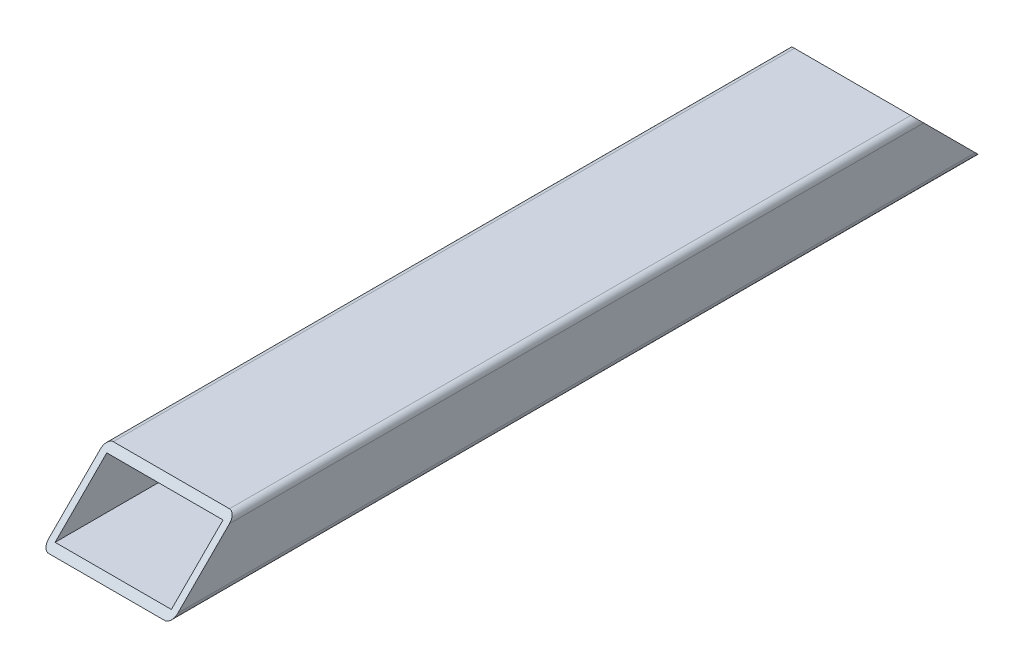
ISO-10303-21;
HEADER;
FILE_DESCRIPTION(('STEP AP214'),'2;1');
FILE_NAME('part.step','',(''),(''),'','','');
FILE_SCHEMA(('AUTOMOTIVE_DESIGN { 1 0 10303 214 1 1 1 1 }'));
ENDSEC;
DATA;
#1=APPLICATION_CONTEXT('core data for automotive mechanical design processes');
#2=APPLICATION_PROTOCOL_DEFINITION('international standard','automotive_design',2000,#1);
#3=PRODUCT_CONTEXT('',#1,'mechanical');
#4=PRODUCT('Part','Part','',(#3));
#5=PRODUCT_RELATED_PRODUCT_CATEGORY('part','',(#4));
#6=PRODUCT_DEFINITION_FORMATION('','',#4);
#7=PRODUCT_DEFINITION_CONTEXT('part definition',#1,'design');
#8=PRODUCT_DEFINITION('design','',#6,#7);
#9=PRODUCT_DEFINITION_SHAPE('','',#8);
#10=(LENGTH_UNIT() NAMED_UNIT(*) SI_UNIT(.MILLI.,.METRE.));
#11=(NAMED_UNIT(*) PLANE_ANGLE_UNIT() SI_UNIT($,.RADIAN.));
#12=(NAMED_UNIT(*) SI_UNIT($,.STERADIAN.) SOLID_ANGLE_UNIT());
#13=UNCERTAINTY_MEASURE_WITH_UNIT(LENGTH_MEASURE(1.E-05),#10,'distance_accuracy_value','');
#14=(GEOMETRIC_REPRESENTATION_CONTEXT(3) GLOBAL_UNCERTAINTY_ASSIGNED_CONTEXT((#13)) GLOBAL_UNIT_ASSIGNED_CONTEXT((#10,
#11,#12)) REPRESENTATION_CONTEXT('',''));
#15=CARTESIAN_POINT('',(0.,0.,0.));
#16=DIRECTION('',(0.,0.,1.));
#17=DIRECTION('',(1.,0.,0.));
#18=AXIS2_PLACEMENT_3D('',#15,#16,#17);
#19=CARTESIAN_POINT('',(-36.,16.,-251.));
#20=DIRECTION('',(0.,1.,0.));
#21=DIRECTION('',(0.,0.,1.));
#22=AXIS2_PLACEMENT_3D('',#19,#20,#21);
#23=PLANE('',#22);
#24=DIRECTION('',(1.,0.,0.));
#25=VECTOR('',#24,1.);
#26=CARTESIAN_POINT('',(-36.,16.,215.));
#27=LINE('',#26,#25);
#28=CARTESIAN_POINT('',(-36.,16.,215.));
#29=VERTEX_POINT('',#28);
#30=CARTESIAN_POINT('',(36.,16.,215.));
#31=VERTEX_POINT('',#30);
#32=EDGE_CURVE('E214',#29,#31,#27,.T.);
#33=ORIENTED_EDGE('',*,*,#32,.F.);
#34=DIRECTION('',(0.,0.,1.));
#35=VECTOR('',#34,1.);
#36=CARTESIAN_POINT('',(-36.,16.,-251.));
#37=LINE('',#36,#35);
#38=CARTESIAN_POINT('',(-36.,16.,-215.));
#39=VERTEX_POINT('',#38);
#40=EDGE_CURVE('E169',#39,#29,#37,.T.);
#41=ORIENTED_EDGE('',*,*,#40,.F.);
#42=DIRECTION('',(-1.,0.,0.));
#43=VECTOR('',#42,1.);
#44=CARTESIAN_POINT('',(-36.,16.,-215.));
#45=LINE('',#44,#43);
#46=CARTESIAN_POINT('',(36.,16.,-215.));
#47=VERTEX_POINT('',#46);
#48=EDGE_CURVE('E56',#47,#39,#45,.T.);
#49=ORIENTED_EDGE('',*,*,#48,.F.);
#50=DIRECTION('',(0.,0.,1.));
#51=VECTOR('',#50,1.);
#52=CARTESIAN_POINT('',(36.,16.,-251.));
#53=LINE('',#52,#51);
#54=EDGE_CURVE('E151',#47,#31,#53,.T.);
#55=ORIENTED_EDGE('',*,*,#54,.T.);
#56=EDGE_LOOP('',(#33,#41,#49,#55));
#57=FACE_BOUND('',#56,.T.);
#58=ADVANCED_FACE('F34',(#57),#23,.F.);
#59=CARTESIAN_POINT('',(36.,16.,-251.));
#60=DIRECTION('',(1.,0.,0.));
#61=DIRECTION('',(0.,1.,0.));
#62=AXIS2_PLACEMENT_3D('',#59,#60,#61);
#63=PLANE('',#62);
#64=DIRECTION('',(0.,-0.707106781186551,0.707106781186544));
#65=VECTOR('',#64,1.);
#66=CARTESIAN_POINT('',(36.,249.,-17.9999999999974));
#67=LINE('',#66,#65);
#68=CARTESIAN_POINT('',(36.,-16.,247.));
#69=VERTEX_POINT('',#68);
#70=EDGE_CURVE('E216',#31,#69,#67,.T.);
#71=ORIENTED_EDGE('',*,*,#70,.F.);
#72=ORIENTED_EDGE('',*,*,#54,.F.);
#73=DIRECTION('',(0.,0.707106781186551,0.707106781186544));
#74=VECTOR('',#73,1.);
#75=CARTESIAN_POINT('',(36.,-1.99999999999982,-233.));
#76=LINE('',#75,#74);
#77=CARTESIAN_POINT('',(36.,-16.,-247.));
#78=VERTEX_POINT('',#77);
#79=EDGE_CURVE('E199',#78,#47,#76,.T.);
#80=ORIENTED_EDGE('',*,*,#79,.F.);
#81=DIRECTION('',(0.,0.,1.));
#82=VECTOR('',#81,1.);
#83=CARTESIAN_POINT('',(36.,-16.,-251.));
#84=LINE('',#83,#82);
#85=EDGE_CURVE('E176',#78,#69,#84,.T.);
#86=ORIENTED_EDGE('',*,*,#85,.T.);
#87=EDGE_LOOP('',(#71,#72,#80,#86));
#88=FACE_BOUND('',#87,.T.);
#89=ADVANCED_FACE('F249',(#88),#63,.F.);
#90=CARTESIAN_POINT('',(-36.,-16.,-251.));
#91=DIRECTION('',(0.,-1.,0.));
#92=DIRECTION('',(0.,0.,-1.));
#93=AXIS2_PLACEMENT_3D('',#90,#91,#92);
#94=PLANE('',#93);
#95=DIRECTION('',(-1.,0.,0.));
#96=VECTOR('',#95,1.);
#97=CARTESIAN_POINT('',(-36.,-16.,247.));
#98=LINE('',#97,#96);
#99=CARTESIAN_POINT('',(-36.,-16.,247.));
#100=VERTEX_POINT('',#99);
#101=EDGE_CURVE('E49',#69,#100,#98,.T.);
#102=ORIENTED_EDGE('',*,*,#101,.F.);
#103=ORIENTED_EDGE('',*,*,#85,.F.);
#104=DIRECTION('',(1.,0.,0.));
#105=VECTOR('',#104,1.);
#106=CARTESIAN_POINT('',(-36.,-16.,-247.));
#107=LINE('',#106,#105);
#108=CARTESIAN_POINT('',(-36.,-16.,-247.));
#109=VERTEX_POINT('',#108);
#110=EDGE_CURVE('E132',#109,#78,#107,.T.);
#111=ORIENTED_EDGE('',*,*,#110,.F.);
#112=DIRECTION('',(0.,0.,1.));
#113=VECTOR('',#112,1.);
#114=CARTESIAN_POINT('',(-36.,-16.,-251.));
#115=LINE('',#114,#113);
#116=EDGE_CURVE('E172',#109,#100,#115,.T.);
#117=ORIENTED_EDGE('',*,*,#116,.T.);
#118=EDGE_LOOP('',(#102,#103,#111,#117));
#119=FACE_BOUND('',#118,.T.);
#120=ADVANCED_FACE('F254',(#119),#94,.F.);
#121=CARTESIAN_POINT('',(-36.,16.,-251.));
#122=DIRECTION('',(-1.,0.,0.));
#123=DIRECTION('',(0.,-1.,0.));
#124=AXIS2_PLACEMENT_3D('',#121,#122,#123);
#125=PLANE('',#124);
#126=DIRECTION('',(0.,0.707106781186551,-0.707106781186544));
#127=VECTOR('',#126,1.);
#128=CARTESIAN_POINT('',(-36.,249.,-17.9999999999974));
#129=LINE('',#128,#127);
#130=EDGE_CURVE('E142',#100,#29,#129,.T.);
#131=ORIENTED_EDGE('',*,*,#130,.F.);
#132=ORIENTED_EDGE('',*,*,#116,.F.);
#133=DIRECTION('',(0.,-0.707106781186551,-0.707106781186544));
#134=VECTOR('',#133,1.);
#135=CARTESIAN_POINT('',(-36.,-1.99999999999982,-233.));
#136=LINE('',#135,#134);
#137=EDGE_CURVE('E11',#39,#109,#136,.T.);
#138=ORIENTED_EDGE('',*,*,#137,.F.);
#139=ORIENTED_EDGE('',*,*,#40,.T.);
#140=EDGE_LOOP('',(#131,#132,#138,#139));
#141=FACE_BOUND('',#140,.T.);
#142=ADVANCED_FACE('F259',(#141),#125,.F.);
#143=CARTESIAN_POINT('',(75.,20.,211.));
#144=DIRECTION('',(0.,0.707106781186544,0.707106781186551));
#145=DIRECTION('',(0.,-0.707106781186551,0.707106781186544));
#146=AXIS2_PLACEMENT_3D('',#143,#144,#145);
#147=PLANE('',#146);
#148=DIRECTION('',(-1.,0.,0.));
#149=VECTOR('',#148,1.);
#150=CARTESIAN_POINT('',(75.,20.,211.));
#151=LINE('',#150,#149);
#152=CARTESIAN_POINT('',(36.,20.,211.));
#153=VERTEX_POINT('',#152);
#154=CARTESIAN_POINT('',(-36.,20.,211.));
#155=VERTEX_POINT('',#154);
#156=EDGE_CURVE('E124',#153,#155,#151,.T.);
#157=ORIENTED_EDGE('',*,*,#156,.T.);
#158=CARTESIAN_POINT('',(-36.,16.,215.));
#159=DIRECTION('',(0.,0.707106781186544,0.707106781186551));
#160=DIRECTION('',(0.,-0.707106781186551,0.707106781186544));
#161=AXIS2_PLACEMENT_3D('',#158,#159,#160);
#162=ELLIPSE('',#161,5.65685424949235,4.);
#163=CARTESIAN_POINT('',(-40.,16.,215.));
#164=VERTEX_POINT('',#163);
#165=EDGE_CURVE('E212',#164,#155,#162,.F.);
#166=ORIENTED_EDGE('',*,*,#165,.F.);
#167=DIRECTION('',(0.,0.707106781186551,-0.707106781186544));
#168=VECTOR('',#167,1.);
#169=CARTESIAN_POINT('',(-40.,249.,-17.9999999999974));
#170=LINE('',#169,#168);
#171=CARTESIAN_POINT('',(-40.,-16.,247.));
#172=VERTEX_POINT('',#171);
#173=EDGE_CURVE('E209',#172,#164,#170,.T.);
#174=ORIENTED_EDGE('',*,*,#173,.F.);
#175=CARTESIAN_POINT('',(-36.,-16.,247.));
#176=DIRECTION('',(0.,0.707106781186544,0.707106781186551));
#177=DIRECTION('',(0.,-0.707106781186551,0.707106781186544));
#178=AXIS2_PLACEMENT_3D('',#175,#176,#177);
#179=ELLIPSE('',#178,5.65685424949235,4.);
#180=CARTESIAN_POINT('',(-36.,-20.,251.));
#181=VERTEX_POINT('',#180);
#182=EDGE_CURVE('E206',#181,#172,#179,.F.);
#183=ORIENTED_EDGE('',*,*,#182,.F.);
#184=DIRECTION('',(1.,0.,0.));
#185=VECTOR('',#184,1.);
#186=CARTESIAN_POINT('',(-36.,-20.,251.));
#187=LINE('',#186,#185);
#188=CARTESIAN_POINT('',(36.,-20.,251.));
#189=VERTEX_POINT('',#188);
#190=EDGE_CURVE('E173',#181,#189,#187,.T.);
#191=ORIENTED_EDGE('',*,*,#190,.T.);
#192=CARTESIAN_POINT('',(36.,-16.,247.));
#193=DIRECTION('',(0.,0.707106781186544,0.707106781186551));
#194=DIRECTION('',(0.,-0.707106781186551,0.707106781186544));
#195=AXIS2_PLACEMENT_3D('',#192,#193,#194);
#196=ELLIPSE('',#195,5.65685424949235,4.);
#197=CARTESIAN_POINT('',(40.,-16.,247.));
#198=VERTEX_POINT('',#197);
#199=EDGE_CURVE('E203',#198,#189,#196,.F.);
#200=ORIENTED_EDGE('',*,*,#199,.F.);
#201=DIRECTION('',(0.,-0.707106781186551,0.707106781186544));
#202=VECTOR('',#201,1.);
#203=CARTESIAN_POINT('',(39.9999999999999,249.,-17.9999999999974));
#204=LINE('',#203,#202);
#205=CARTESIAN_POINT('',(40.,16.,215.));
#206=VERTEX_POINT('',#205);
#207=EDGE_CURVE('E127',#206,#198,#204,.T.);
#208=ORIENTED_EDGE('',*,*,#207,.F.);
#209=CARTESIAN_POINT('',(36.,16.,215.));
#210=DIRECTION('',(0.,0.707106781186544,0.707106781186551));
#211=DIRECTION('',(0.,-0.707106781186551,0.707106781186544));
#212=AXIS2_PLACEMENT_3D('',#209,#210,#211);
#213=ELLIPSE('',#212,5.65685424949235,4.);
#214=EDGE_CURVE('E121',#153,#206,#213,.F.);
#215=ORIENTED_EDGE('',*,*,#214,.F.);
#216=EDGE_LOOP('',(#157,#166,#174,#183,#191,#200,#208,#215));
#217=FACE_BOUND('',#216,.T.);
#218=ORIENTED_EDGE('',*,*,#32,.T.);
#219=ORIENTED_EDGE('',*,*,#70,.T.);
#220=ORIENTED_EDGE('',*,*,#101,.T.);
#221=ORIENTED_EDGE('',*,*,#130,.T.);
#222=EDGE_LOOP('',(#218,#219,#220,#221));
#223=FACE_BOUND('',#222,.T.);
#224=ADVANCED_FACE('F123',(#217,#223),#147,.T.);
#225=CARTESIAN_POINT('',(75.,-20.,-251.));
#226=DIRECTION('',(0.,0.707106781186544,-0.707106781186551));
#227=DIRECTION('',(0.,0.707106781186551,0.707106781186544));
#228=AXIS2_PLACEMENT_3D('',#225,#226,#227);
#229=PLANE('',#228);
#230=DIRECTION('',(0.,0.707106781186551,0.707106781186544));
#231=VECTOR('',#230,1.);
#232=CARTESIAN_POINT('',(40.,-1.99999999999982,-233.));
#233=LINE('',#232,#231);
#234=CARTESIAN_POINT('',(40.,-16.,-247.));
#235=VERTEX_POINT('',#234);
#236=CARTESIAN_POINT('',(40.,16.,-215.));
#237=VERTEX_POINT('',#236);
#238=EDGE_CURVE('E183',#235,#237,#233,.T.);
#239=ORIENTED_EDGE('',*,*,#238,.F.);
#240=CARTESIAN_POINT('',(36.,-16.,-247.));
#241=DIRECTION('',(0.,0.707106781186544,-0.707106781186551));
#242=DIRECTION('',(0.,0.707106781186551,0.707106781186544));
#243=AXIS2_PLACEMENT_3D('',#240,#241,#242);
#244=ELLIPSE('',#243,5.65685424949235,4.);
#245=CARTESIAN_POINT('',(36.,-20.,-251.));
#246=VERTEX_POINT('',#245);
#247=EDGE_CURVE('E186',#246,#235,#244,.F.);
#248=ORIENTED_EDGE('',*,*,#247,.F.);
#249=DIRECTION('',(1.,0.,0.));
#250=VECTOR('',#249,1.);
#251=CARTESIAN_POINT('',(-36.,-20.,-251.));
#252=LINE('',#251,#250);
#253=CARTESIAN_POINT('',(-36.,-20.,-251.));
#254=VERTEX_POINT('',#253);
#255=EDGE_CURVE('E147',#254,#246,#252,.T.);
#256=ORIENTED_EDGE('',*,*,#255,.F.);
#257=CARTESIAN_POINT('',(-36.,-16.,-247.));
#258=DIRECTION('',(0.,0.707106781186544,-0.707106781186551));
#259=DIRECTION('',(0.,0.707106781186551,0.707106781186544));
#260=AXIS2_PLACEMENT_3D('',#257,#258,#259);
#261=ELLIPSE('',#260,5.65685424949235,4.);
#262=CARTESIAN_POINT('',(-40.,-16.,-247.));
#263=VERTEX_POINT('',#262);
#264=EDGE_CURVE('E189',#263,#254,#261,.F.);
#265=ORIENTED_EDGE('',*,*,#264,.F.);
#266=DIRECTION('',(0.,-0.707106781186551,-0.707106781186544));
#267=VECTOR('',#266,1.);
#268=CARTESIAN_POINT('',(-40.,-1.99999999999982,-233.));
#269=LINE('',#268,#267);
#270=CARTESIAN_POINT('',(-40.,16.,-215.));
#271=VERTEX_POINT('',#270);
#272=EDGE_CURVE('E192',#271,#263,#269,.T.);
#273=ORIENTED_EDGE('',*,*,#272,.F.);
#274=CARTESIAN_POINT('',(-36.,16.,-215.));
#275=DIRECTION('',(0.,0.707106781186544,-0.707106781186551));
#276=DIRECTION('',(0.,0.707106781186551,0.707106781186544));
#277=AXIS2_PLACEMENT_3D('',#274,#275,#276);
#278=ELLIPSE('',#277,5.65685424949235,4.);
#279=CARTESIAN_POINT('',(-36.,20.,-211.));
#280=VERTEX_POINT('',#279);
#281=EDGE_CURVE('E195',#280,#271,#278,.F.);
#282=ORIENTED_EDGE('',*,*,#281,.F.);
#283=DIRECTION('',(-1.,0.,0.));
#284=VECTOR('',#283,1.);
#285=CARTESIAN_POINT('',(75.,20.,-211.));
#286=LINE('',#285,#284);
#287=CARTESIAN_POINT('',(36.,20.,-211.));
#288=VERTEX_POINT('',#287);
#289=EDGE_CURVE('E143',#288,#280,#286,.T.);
#290=ORIENTED_EDGE('',*,*,#289,.F.);
#291=CARTESIAN_POINT('',(36.,16.,-215.));
#292=DIRECTION('',(0.,0.707106781186544,-0.707106781186551));
#293=DIRECTION('',(0.,0.707106781186551,0.707106781186544));
#294=AXIS2_PLACEMENT_3D('',#291,#292,#293);
#295=ELLIPSE('',#294,5.65685424949235,4.);
#296=EDGE_CURVE('E146',#237,#288,#295,.F.);
#297=ORIENTED_EDGE('',*,*,#296,.F.);
#298=EDGE_LOOP('',(#239,#248,#256,#265,#273,#282,#290,#297));
#299=FACE_BOUND('',#298,.T.);
#300=ORIENTED_EDGE('',*,*,#48,.T.);
#301=ORIENTED_EDGE('',*,*,#137,.T.);
#302=ORIENTED_EDGE('',*,*,#110,.T.);
#303=ORIENTED_EDGE('',*,*,#79,.T.);
#304=EDGE_LOOP('',(#300,#301,#302,#303));
#305=FACE_BOUND('',#304,.T.);
#306=ADVANCED_FACE('F237',(#299,#305),#229,.T.);
#307=CARTESIAN_POINT('',(-36.,20.,-251.));
#308=DIRECTION('',(0.,1.,0.));
#309=DIRECTION('',(0.,0.,1.));
#310=AXIS2_PLACEMENT_3D('',#307,#308,#309);
#311=PLANE('',#310);
#312=DIRECTION('',(0.,0.,1.));
#313=VECTOR('',#312,1.);
#314=CARTESIAN_POINT('',(-36.,20.,-251.));
#315=LINE('',#314,#313);
#316=EDGE_CURVE('E141',#280,#155,#315,.T.);
#317=ORIENTED_EDGE('',*,*,#316,.T.);
#318=ORIENTED_EDGE('',*,*,#156,.F.);
#319=DIRECTION('',(0.,0.,1.));
#320=VECTOR('',#319,1.);
#321=CARTESIAN_POINT('',(36.,20.,-251.));
#322=LINE('',#321,#320);
#323=EDGE_CURVE('E139',#288,#153,#322,.T.);
#324=ORIENTED_EDGE('',*,*,#323,.F.);
#325=ORIENTED_EDGE('',*,*,#289,.T.);
#326=EDGE_LOOP('',(#317,#318,#324,#325));
#327=FACE_BOUND('',#326,.T.);
#328=ADVANCED_FACE('F137',(#327),#311,.T.);
#329=CARTESIAN_POINT('',(-36.,16.,-251.));
#330=DIRECTION('',(0.,0.,1.));
#331=DIRECTION('',(1.,0.,0.));
#332=AXIS2_PLACEMENT_3D('',#329,#330,#331);
#333=CYLINDRICAL_SURFACE('',#332,4.);
#334=DIRECTION('',(0.,0.,1.));
#335=VECTOR('',#334,1.);
#336=CARTESIAN_POINT('',(-40.,16.,-251.));
#337=LINE('',#336,#335);
#338=EDGE_CURVE('E148',#271,#164,#337,.T.);
#339=ORIENTED_EDGE('',*,*,#338,.T.);
#340=ORIENTED_EDGE('',*,*,#165,.T.);
#341=ORIENTED_EDGE('',*,*,#316,.F.);
#342=ORIENTED_EDGE('',*,*,#281,.T.);
#343=EDGE_LOOP('',(#339,#340,#341,#342));
#344=FACE_BOUND('',#343,.T.);
#345=ADVANCED_FACE('F222',(#344),#333,.T.);
#346=CARTESIAN_POINT('',(-40.,16.,-251.));
#347=DIRECTION('',(-1.,0.,0.));
#348=DIRECTION('',(0.,-1.,0.));
#349=AXIS2_PLACEMENT_3D('',#346,#347,#348);
#350=PLANE('',#349);
#351=DIRECTION('',(0.,0.,1.));
#352=VECTOR('',#351,1.);
#353=CARTESIAN_POINT('',(-40.,-16.,-251.));
#354=LINE('',#353,#352);
#355=EDGE_CURVE('E156',#263,#172,#354,.T.);
#356=ORIENTED_EDGE('',*,*,#355,.T.);
#357=ORIENTED_EDGE('',*,*,#173,.T.);
#358=ORIENTED_EDGE('',*,*,#338,.F.);
#359=ORIENTED_EDGE('',*,*,#272,.T.);
#360=EDGE_LOOP('',(#356,#357,#358,#359));
#361=FACE_BOUND('',#360,.T.);
#362=ADVANCED_FACE('F225',(#361),#350,.T.);
#363=CARTESIAN_POINT('',(-36.,-20.,-251.));
#364=DIRECTION('',(0.,-1.,0.));
#365=DIRECTION('',(0.,0.,-1.));
#366=AXIS2_PLACEMENT_3D('',#363,#364,#365);
#367=PLANE('',#366);
#368=DIRECTION('',(0.,0.,1.));
#369=VECTOR('',#368,1.);
#370=CARTESIAN_POINT('',(36.,-20.,-251.));
#371=LINE('',#370,#369);
#372=EDGE_CURVE('E162',#246,#189,#371,.T.);
#373=ORIENTED_EDGE('',*,*,#372,.T.);
#374=ORIENTED_EDGE('',*,*,#190,.F.);
#375=DIRECTION('',(0.,0.,1.));
#376=VECTOR('',#375,1.);
#377=CARTESIAN_POINT('',(-36.,-20.,-251.));
#378=LINE('',#377,#376);
#379=EDGE_CURVE('E159',#254,#181,#378,.T.);
#380=ORIENTED_EDGE('',*,*,#379,.F.);
#381=ORIENTED_EDGE('',*,*,#255,.T.);
#382=EDGE_LOOP('',(#373,#374,#380,#381));
#383=FACE_BOUND('',#382,.T.);
#384=ADVANCED_FACE('F236',(#383),#367,.T.);
#385=CARTESIAN_POINT('',(-36.,-16.,-251.));
#386=DIRECTION('',(0.,0.,1.));
#387=DIRECTION('',(1.,0.,0.));
#388=AXIS2_PLACEMENT_3D('',#385,#386,#387);
#389=CYLINDRICAL_SURFACE('',#388,4.);
#390=ORIENTED_EDGE('',*,*,#379,.T.);
#391=ORIENTED_EDGE('',*,*,#182,.T.);
#392=ORIENTED_EDGE('',*,*,#355,.F.);
#393=ORIENTED_EDGE('',*,*,#264,.T.);
#394=EDGE_LOOP('',(#390,#391,#392,#393));
#395=FACE_BOUND('',#394,.T.);
#396=ADVANCED_FACE('F228',(#395),#389,.T.);
#397=CARTESIAN_POINT('',(36.,-16.,-251.));
#398=DIRECTION('',(0.,0.,1.));
#399=DIRECTION('',(1.,0.,0.));
#400=AXIS2_PLACEMENT_3D('',#397,#398,#399);
#401=CYLINDRICAL_SURFACE('',#400,4.);
#402=DIRECTION('',(0.,0.,1.));
#403=VECTOR('',#402,1.);
#404=CARTESIAN_POINT('',(40.,-16.,-251.));
#405=LINE('',#404,#403);
#406=EDGE_CURVE('E165',#235,#198,#405,.T.);
#407=ORIENTED_EDGE('',*,*,#406,.T.);
#408=ORIENTED_EDGE('',*,*,#199,.T.);
#409=ORIENTED_EDGE('',*,*,#372,.F.);
#410=ORIENTED_EDGE('',*,*,#247,.T.);
#411=EDGE_LOOP('',(#407,#408,#409,#410));
#412=FACE_BOUND('',#411,.T.);
#413=ADVANCED_FACE('F234',(#412),#401,.T.);
#414=CARTESIAN_POINT('',(40.,16.,-251.));
#415=DIRECTION('',(1.,0.,0.));
#416=DIRECTION('',(0.,1.,0.));
#417=AXIS2_PLACEMENT_3D('',#414,#415,#416);
#418=PLANE('',#417);
#419=DIRECTION('',(0.,0.,1.));
#420=VECTOR('',#419,1.);
#421=CARTESIAN_POINT('',(40.,16.,-251.));
#422=LINE('',#421,#420);
#423=EDGE_CURVE('E42',#237,#206,#422,.T.);
#424=ORIENTED_EDGE('',*,*,#423,.T.);
#425=ORIENTED_EDGE('',*,*,#207,.T.);
#426=ORIENTED_EDGE('',*,*,#406,.F.);
#427=ORIENTED_EDGE('',*,*,#238,.T.);
#428=EDGE_LOOP('',(#424,#425,#426,#427));
#429=FACE_BOUND('',#428,.T.);
#430=ADVANCED_FACE('F239',(#429),#418,.T.);
#431=CARTESIAN_POINT('',(36.,16.,-251.));
#432=DIRECTION('',(0.,0.,1.));
#433=DIRECTION('',(1.,0.,0.));
#434=AXIS2_PLACEMENT_3D('',#431,#432,#433);
#435=CYLINDRICAL_SURFACE('',#434,4.);
#436=ORIENTED_EDGE('',*,*,#323,.T.);
#437=ORIENTED_EDGE('',*,*,#214,.T.);
#438=ORIENTED_EDGE('',*,*,#423,.F.);
#439=ORIENTED_EDGE('',*,*,#296,.T.);
#440=EDGE_LOOP('',(#436,#437,#438,#439));
#441=FACE_BOUND('',#440,.T.);
#442=ADVANCED_FACE('F36',(#441),#435,.T.);
#443=CLOSED_SHELL('',(#58,#89,#120,#142,#224,#306,#328,#345,#362,#384,#396,#413,#430,#442));
#444=MANIFOLD_SOLID_BREP('B2',#443);
#445=ADVANCED_BREP_SHAPE_REPRESENTATION('',(#18,#444),#14);
#446=SHAPE_DEFINITION_REPRESENTATION(#9,#445);
ENDSEC;
END-ISO-10303-21;
